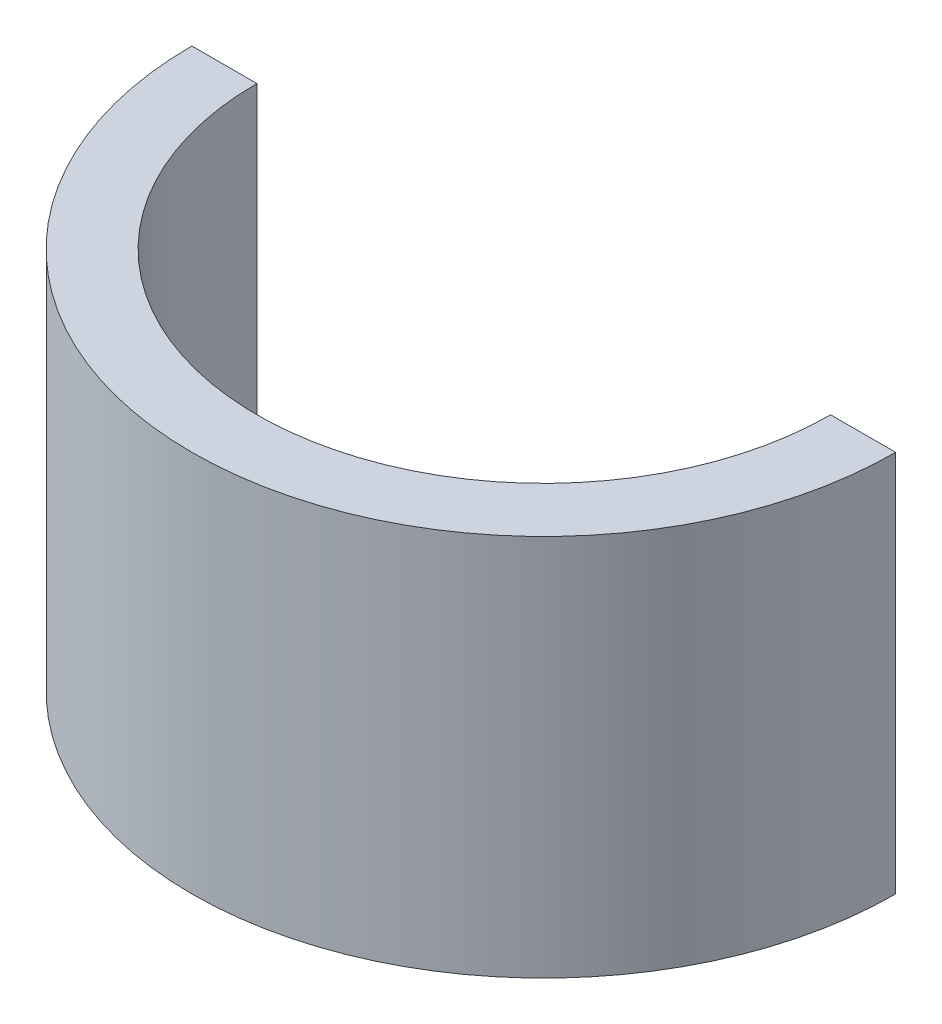
ISO-10303-21;
HEADER;
FILE_DESCRIPTION(('STEP AP214'),'2;1');
FILE_NAME('part.step','',(''),(''),'','','');
FILE_SCHEMA(('AUTOMOTIVE_DESIGN { 1 0 10303 214 1 1 1 1 }'));
ENDSEC;
DATA;
#1=APPLICATION_CONTEXT('core data for automotive mechanical design processes');
#2=APPLICATION_PROTOCOL_DEFINITION('international standard','automotive_design',2000,#1);
#3=PRODUCT_CONTEXT('',#1,'mechanical');
#4=PRODUCT('Part','Part','',(#3));
#5=PRODUCT_RELATED_PRODUCT_CATEGORY('part','',(#4));
#6=PRODUCT_DEFINITION_FORMATION('','',#4);
#7=PRODUCT_DEFINITION_CONTEXT('part definition',#1,'design');
#8=PRODUCT_DEFINITION('design','',#6,#7);
#9=PRODUCT_DEFINITION_SHAPE('','',#8);
#10=(LENGTH_UNIT() NAMED_UNIT(*) SI_UNIT(.MILLI.,.METRE.));
#11=(NAMED_UNIT(*) PLANE_ANGLE_UNIT() SI_UNIT($,.RADIAN.));
#12=(NAMED_UNIT(*) SI_UNIT($,.STERADIAN.) SOLID_ANGLE_UNIT());
#13=UNCERTAINTY_MEASURE_WITH_UNIT(LENGTH_MEASURE(1.E-05),#10,'distance_accuracy_value','');
#14=(GEOMETRIC_REPRESENTATION_CONTEXT(3) GLOBAL_UNCERTAINTY_ASSIGNED_CONTEXT((#13)) GLOBAL_UNIT_ASSIGNED_CONTEXT((#10,
#11,#12)) REPRESENTATION_CONTEXT('',''));
#15=CARTESIAN_POINT('',(0.,0.,0.));
#16=DIRECTION('',(0.,0.,1.));
#17=DIRECTION('',(1.,0.,0.));
#18=AXIS2_PLACEMENT_3D('',#15,#16,#17);
#19=CARTESIAN_POINT('',(0.,50.,0.));
#20=DIRECTION('',(0.,1.,0.));
#21=DIRECTION('',(0.,0.,1.));
#22=AXIS2_PLACEMENT_3D('',#19,#20,#21);
#23=PLANE('',#22);
#24=DIRECTION('',(1.,0.,0.));
#25=VECTOR('',#24,1.);
#26=CARTESIAN_POINT('',(0.,50.,0.));
#27=LINE('',#26,#25);
#28=CARTESIAN_POINT('',(-46.,50.,0.));
#29=VERTEX_POINT('',#28);
#30=CARTESIAN_POINT('',(-37.5,50.,0.));
#31=VERTEX_POINT('',#30);
#32=EDGE_CURVE('E55',#29,#31,#27,.T.);
#33=ORIENTED_EDGE('',*,*,#32,.F.);
#34=CARTESIAN_POINT('',(0.,50.,0.));
#35=DIRECTION('',(0.,1.,0.));
#36=DIRECTION('',(0.,0.,1.));
#37=AXIS2_PLACEMENT_3D('',#34,#35,#36);
#38=CIRCLE('',#37,46.);
#39=CARTESIAN_POINT('',(46.,50.,0.));
#40=VERTEX_POINT('',#39);
#41=EDGE_CURVE('E87',#29,#40,#38,.T.);
#42=ORIENTED_EDGE('',*,*,#41,.T.);
#43=CARTESIAN_POINT('',(37.5,50.,0.));
#44=VERTEX_POINT('',#43);
#45=EDGE_CURVE('E79',#44,#40,#27,.T.);
#46=ORIENTED_EDGE('',*,*,#45,.F.);
#47=CARTESIAN_POINT('',(0.,50.,0.));
#48=DIRECTION('',(0.,1.,0.));
#49=DIRECTION('',(0.,0.,1.));
#50=AXIS2_PLACEMENT_3D('',#47,#48,#49);
#51=CIRCLE('',#50,37.5);
#52=EDGE_CURVE('E91',#31,#44,#51,.T.);
#53=ORIENTED_EDGE('',*,*,#52,.F.);
#54=EDGE_LOOP('',(#33,#42,#46,#53));
#55=FACE_BOUND('',#54,.T.);
#56=ADVANCED_FACE('F33',(#55),#23,.T.);
#57=CARTESIAN_POINT('',(0.,0.,0.));
#58=DIRECTION('',(0.,1.,0.));
#59=DIRECTION('',(0.,0.,1.));
#60=AXIS2_PLACEMENT_3D('',#57,#58,#59);
#61=PLANE('',#60);
#62=CARTESIAN_POINT('',(0.,0.,0.));
#63=DIRECTION('',(0.,1.,0.));
#64=DIRECTION('',(0.,0.,1.));
#65=AXIS2_PLACEMENT_3D('',#62,#63,#64);
#66=CIRCLE('',#65,46.);
#67=CARTESIAN_POINT('',(-46.,0.,0.));
#68=VERTEX_POINT('',#67);
#69=CARTESIAN_POINT('',(46.,0.,0.));
#70=VERTEX_POINT('',#69);
#71=EDGE_CURVE('E85',#68,#70,#66,.T.);
#72=ORIENTED_EDGE('',*,*,#71,.F.);
#73=DIRECTION('',(1.,0.,0.));
#74=VECTOR('',#73,1.);
#75=CARTESIAN_POINT('',(49.928479328044,0.,0.));
#76=LINE('',#75,#74);
#77=CARTESIAN_POINT('',(-37.5,0.,0.));
#78=VERTEX_POINT('',#77);
#79=EDGE_CURVE('E71',#68,#78,#76,.T.);
#80=ORIENTED_EDGE('',*,*,#79,.T.);
#81=CARTESIAN_POINT('',(0.,0.,0.));
#82=DIRECTION('',(0.,1.,0.));
#83=DIRECTION('',(0.,0.,1.));
#84=AXIS2_PLACEMENT_3D('',#81,#82,#83);
#85=CIRCLE('',#84,37.5);
#86=CARTESIAN_POINT('',(37.5,0.,0.));
#87=VERTEX_POINT('',#86);
#88=EDGE_CURVE('E88',#78,#87,#85,.T.);
#89=ORIENTED_EDGE('',*,*,#88,.T.);
#90=EDGE_CURVE('E48',#87,#70,#76,.T.);
#91=ORIENTED_EDGE('',*,*,#90,.T.);
#92=EDGE_LOOP('',(#72,#80,#89,#91));
#93=FACE_BOUND('',#92,.T.);
#94=ADVANCED_FACE('F90',(#93),#61,.F.);
#95=CARTESIAN_POINT('',(0.,50.,0.));
#96=DIRECTION('',(0.,-1.,0.));
#97=DIRECTION('',(0.,0.,-1.));
#98=AXIS2_PLACEMENT_3D('',#95,#96,#97);
#99=CYLINDRICAL_SURFACE('',#98,46.);
#100=ORIENTED_EDGE('',*,*,#41,.F.);
#101=DIRECTION('',(0.,-1.,0.));
#102=VECTOR('',#101,1.);
#103=CARTESIAN_POINT('',(-46.,50.,0.));
#104=LINE('',#103,#102);
#105=EDGE_CURVE('E74',#29,#68,#104,.T.);
#106=ORIENTED_EDGE('',*,*,#105,.T.);
#107=ORIENTED_EDGE('',*,*,#71,.T.);
#108=DIRECTION('',(0.,-1.,0.));
#109=VECTOR('',#108,1.);
#110=CARTESIAN_POINT('',(46.,50.,0.));
#111=LINE('',#110,#109);
#112=EDGE_CURVE('E102',#70,#40,#111,.F.);
#113=ORIENTED_EDGE('',*,*,#112,.T.);
#114=EDGE_LOOP('',(#100,#106,#107,#113));
#115=FACE_BOUND('',#114,.T.);
#116=ADVANCED_FACE('F35',(#115),#99,.T.);
#117=CARTESIAN_POINT('',(0.,50.,0.));
#118=DIRECTION('',(0.,-1.,0.));
#119=DIRECTION('',(0.,0.,-1.));
#120=AXIS2_PLACEMENT_3D('',#117,#118,#119);
#121=CYLINDRICAL_SURFACE('',#120,37.5);
#122=DIRECTION('',(0.,-1.,0.));
#123=VECTOR('',#122,1.);
#124=CARTESIAN_POINT('',(-37.5,50.,0.));
#125=LINE('',#124,#123);
#126=EDGE_CURVE('E11',#31,#78,#125,.T.);
#127=ORIENTED_EDGE('',*,*,#126,.F.);
#128=ORIENTED_EDGE('',*,*,#52,.T.);
#129=DIRECTION('',(0.,-1.,0.));
#130=VECTOR('',#129,1.);
#131=CARTESIAN_POINT('',(37.5,50.,0.));
#132=LINE('',#131,#130);
#133=EDGE_CURVE('E41',#87,#44,#132,.F.);
#134=ORIENTED_EDGE('',*,*,#133,.F.);
#135=ORIENTED_EDGE('',*,*,#88,.F.);
#136=EDGE_LOOP('',(#127,#128,#134,#135));
#137=FACE_BOUND('',#136,.T.);
#138=ADVANCED_FACE('F104',(#137),#121,.F.);
#139=CARTESIAN_POINT('',(49.928479328044,0.,0.));
#140=DIRECTION('',(0.,0.,1.));
#141=DIRECTION('',(1.,0.,0.));
#142=AXIS2_PLACEMENT_3D('',#139,#140,#141);
#143=PLANE('',#142);
#144=ORIENTED_EDGE('',*,*,#90,.F.);
#145=ORIENTED_EDGE('',*,*,#133,.T.);
#146=ORIENTED_EDGE('',*,*,#45,.T.);
#147=ORIENTED_EDGE('',*,*,#112,.F.);
#148=EDGE_LOOP('',(#144,#145,#146,#147));
#149=FACE_BOUND('',#148,.T.);
#150=ADVANCED_FACE('F98',(#149),#143,.F.);
#151=ORIENTED_EDGE('',*,*,#32,.T.);
#152=ORIENTED_EDGE('',*,*,#126,.T.);
#153=ORIENTED_EDGE('',*,*,#79,.F.);
#154=ORIENTED_EDGE('',*,*,#105,.F.);
#155=EDGE_LOOP('',(#151,#152,#153,#154));
#156=FACE_BOUND('',#155,.T.);
#157=ADVANCED_FACE('F73',(#156),#143,.F.);
#158=CLOSED_SHELL('',(#56,#94,#116,#138,#150,#157));
#159=MANIFOLD_SOLID_BREP('B2',#158);
#160=ADVANCED_BREP_SHAPE_REPRESENTATION('',(#18,#159),#14);
#161=SHAPE_DEFINITION_REPRESENTATION(#9,#160);
ENDSEC;
END-ISO-10303-21;
